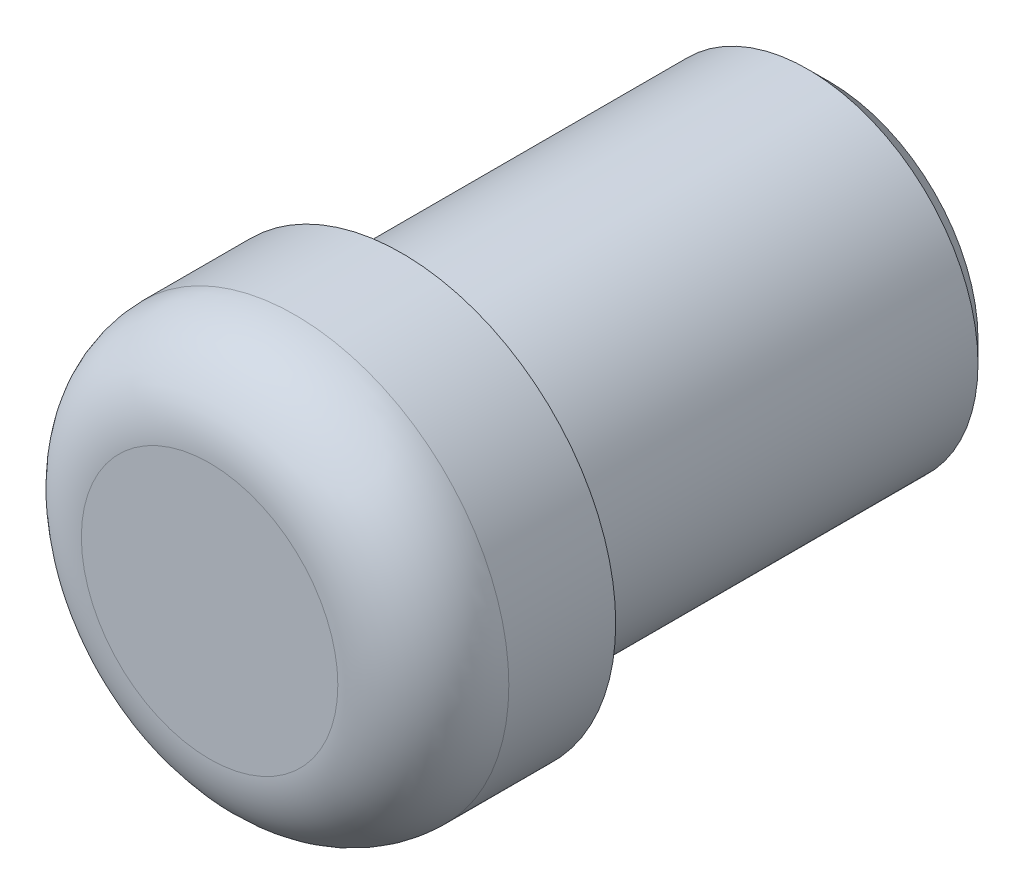
ISO-10303-21;
HEADER;
FILE_DESCRIPTION(('STEP AP214'),'2;1');
FILE_NAME('part.step','',(''),(''),'','','');
FILE_SCHEMA(('AUTOMOTIVE_DESIGN { 1 0 10303 214 1 1 1 1 }'));
ENDSEC;
DATA;
#1=APPLICATION_CONTEXT('core data for automotive mechanical design processes');
#2=APPLICATION_PROTOCOL_DEFINITION('international standard','automotive_design',2000,#1);
#3=PRODUCT_CONTEXT('',#1,'mechanical');
#4=PRODUCT('Part','Part','',(#3));
#5=PRODUCT_RELATED_PRODUCT_CATEGORY('part','',(#4));
#6=PRODUCT_DEFINITION_FORMATION('','',#4);
#7=PRODUCT_DEFINITION_CONTEXT('part definition',#1,'design');
#8=PRODUCT_DEFINITION('design','',#6,#7);
#9=PRODUCT_DEFINITION_SHAPE('','',#8);
#10=(LENGTH_UNIT() NAMED_UNIT(*) SI_UNIT(.MILLI.,.METRE.));
#11=(NAMED_UNIT(*) PLANE_ANGLE_UNIT() SI_UNIT($,.RADIAN.));
#12=(NAMED_UNIT(*) SI_UNIT($,.STERADIAN.) SOLID_ANGLE_UNIT());
#13=UNCERTAINTY_MEASURE_WITH_UNIT(LENGTH_MEASURE(1.E-05),#10,'distance_accuracy_value','');
#14=(GEOMETRIC_REPRESENTATION_CONTEXT(3) GLOBAL_UNCERTAINTY_ASSIGNED_CONTEXT((#13)) GLOBAL_UNIT_ASSIGNED_CONTEXT((#10,
#11,#12)) REPRESENTATION_CONTEXT('',''));
#15=CARTESIAN_POINT('',(0.,0.,0.));
#16=DIRECTION('',(0.,0.,1.));
#17=DIRECTION('',(1.,0.,0.));
#18=AXIS2_PLACEMENT_3D('',#15,#16,#17);
#19=CARTESIAN_POINT('',(0.,0.,10.));
#20=DIRECTION('',(0.,0.,-1.));
#21=DIRECTION('',(-1.,0.,0.));
#22=AXIS2_PLACEMENT_3D('',#19,#20,#21);
#23=CYLINDRICAL_SURFACE('',#22,3.975);
#24=CARTESIAN_POINT('',(0.,0.,0.500000000000002));
#25=DIRECTION('',(0.,0.,1.));
#26=DIRECTION('',(1.,0.,0.));
#27=AXIS2_PLACEMENT_3D('',#24,#25,#26);
#28=CIRCLE('',#27,3.975);
#29=CARTESIAN_POINT('',(3.975,0.,0.500000000000002));
#30=VERTEX_POINT('',#29);
#31=EDGE_CURVE('E52',#30,#30,#28,.T.);
#32=ORIENTED_EDGE('',*,*,#31,.T.);
#33=EDGE_LOOP('',(#32));
#34=FACE_BOUND('',#33,.T.);
#35=CARTESIAN_POINT('',(0.,0.,9.5));
#36=DIRECTION('',(0.,0.,1.));
#37=DIRECTION('',(1.,0.,0.));
#38=AXIS2_PLACEMENT_3D('',#35,#36,#37);
#39=CIRCLE('',#38,3.975);
#40=CARTESIAN_POINT('',(3.975,0.,9.5));
#41=VERTEX_POINT('',#40);
#42=EDGE_CURVE('E57',#41,#41,#39,.F.);
#43=ORIENTED_EDGE('',*,*,#42,.T.);
#44=EDGE_LOOP('',(#43));
#45=FACE_BOUND('',#44,.T.);
#46=ADVANCED_FACE('F43',(#34,#45),#23,.T.);
#47=CARTESIAN_POINT('',(0.,0.,0.));
#48=DIRECTION('',(0.,0.,1.));
#49=DIRECTION('',(1.,0.,0.));
#50=AXIS2_PLACEMENT_3D('',#47,#48,#49);
#51=PLANE('',#50);
#52=CARTESIAN_POINT('',(0.,0.,0.));
#53=DIRECTION('',(0.,0.,1.));
#54=DIRECTION('',(1.,0.,0.));
#55=AXIS2_PLACEMENT_3D('',#52,#53,#54);
#56=CIRCLE('',#55,3.475);
#57=CARTESIAN_POINT('',(3.475,0.,0.));
#58=VERTEX_POINT('',#57);
#59=EDGE_CURVE('E10',#58,#58,#56,.F.);
#60=ORIENTED_EDGE('',*,*,#59,.T.);
#61=EDGE_LOOP('',(#60));
#62=FACE_BOUND('',#61,.T.);
#63=ADVANCED_FACE('F100',(#62),#51,.F.);
#64=CARTESIAN_POINT('',(0.,0.,14.5));
#65=DIRECTION('',(0.,0.,-1.));
#66=DIRECTION('',(-1.,0.,0.));
#67=AXIS2_PLACEMENT_3D('',#64,#65,#66);
#68=CYLINDRICAL_SURFACE('',#67,5.);
#69=CARTESIAN_POINT('',(0.,0.,12.5));
#70=DIRECTION('',(0.,0.,1.));
#71=DIRECTION('',(1.,0.,0.));
#72=AXIS2_PLACEMENT_3D('',#69,#70,#71);
#73=CIRCLE('',#72,5.);
#74=CARTESIAN_POINT('',(5.,0.,12.5));
#75=VERTEX_POINT('',#74);
#76=EDGE_CURVE('E68',#75,#75,#73,.F.);
#77=ORIENTED_EDGE('',*,*,#76,.T.);
#78=EDGE_LOOP('',(#77));
#79=FACE_BOUND('',#78,.T.);
#80=CARTESIAN_POINT('',(0.,0.,10.));
#81=DIRECTION('',(0.,0.,1.));
#82=DIRECTION('',(1.,0.,0.));
#83=AXIS2_PLACEMENT_3D('',#80,#81,#82);
#84=CIRCLE('',#83,5.);
#85=CARTESIAN_POINT('',(5.,0.,10.));
#86=VERTEX_POINT('',#85);
#87=EDGE_CURVE('E76',#86,#86,#84,.T.);
#88=ORIENTED_EDGE('',*,*,#87,.T.);
#89=EDGE_LOOP('',(#88));
#90=FACE_BOUND('',#89,.T.);
#91=ADVANCED_FACE('F81',(#79,#90),#68,.T.);
#92=CARTESIAN_POINT('',(0.,0.,14.5));
#93=DIRECTION('',(0.,0.,1.));
#94=DIRECTION('',(1.,0.,0.));
#95=AXIS2_PLACEMENT_3D('',#92,#93,#94);
#96=PLANE('',#95);
#97=CARTESIAN_POINT('',(0.,0.,14.5));
#98=DIRECTION('',(0.,0.,1.));
#99=DIRECTION('',(1.,0.,0.));
#100=AXIS2_PLACEMENT_3D('',#97,#98,#99);
#101=CIRCLE('',#100,3.);
#102=CARTESIAN_POINT('',(3.,0.,14.5));
#103=VERTEX_POINT('',#102);
#104=EDGE_CURVE('E72',#103,#103,#101,.T.);
#105=ORIENTED_EDGE('',*,*,#104,.T.);
#106=EDGE_LOOP('',(#105));
#107=FACE_BOUND('',#106,.T.);
#108=ADVANCED_FACE('F86',(#107),#96,.T.);
#109=CARTESIAN_POINT('',(0.,0.,10.));
#110=DIRECTION('',(0.,0.,1.));
#111=DIRECTION('',(1.,0.,0.));
#112=AXIS2_PLACEMENT_3D('',#109,#110,#111);
#113=PLANE('',#112);
#114=CARTESIAN_POINT('',(0.,0.,10.));
#115=DIRECTION('',(0.,0.,1.));
#116=DIRECTION('',(1.,0.,0.));
#117=AXIS2_PLACEMENT_3D('',#114,#115,#116);
#118=CIRCLE('',#117,4.475);
#119=CARTESIAN_POINT('',(4.475,0.,10.));
#120=VERTEX_POINT('',#119);
#121=EDGE_CURVE('E62',#120,#120,#118,.T.);
#122=ORIENTED_EDGE('',*,*,#121,.T.);
#123=EDGE_LOOP('',(#122));
#124=FACE_BOUND('',#123,.T.);
#125=ORIENTED_EDGE('',*,*,#87,.F.);
#126=EDGE_LOOP('',(#125));
#127=FACE_BOUND('',#126,.T.);
#128=ADVANCED_FACE('F83',(#124,#127),#113,.F.);
#129=CARTESIAN_POINT('',(0.,0.,12.5));
#130=DIRECTION('',(0.,0.,1.));
#131=DIRECTION('',(1.,0.,0.));
#132=AXIS2_PLACEMENT_3D('',#129,#130,#131);
#133=TOROIDAL_SURFACE('',#132,3.,2.);
#134=ORIENTED_EDGE('',*,*,#76,.F.);
#135=EDGE_LOOP('',(#134));
#136=FACE_BOUND('',#135,.T.);
#137=ORIENTED_EDGE('',*,*,#104,.F.);
#138=EDGE_LOOP('',(#137));
#139=FACE_BOUND('',#138,.T.);
#140=ADVANCED_FACE('F85',(#136,#139),#133,.T.);
#141=CARTESIAN_POINT('',(0.,0.,9.5));
#142=DIRECTION('',(0.,0.,1.));
#143=DIRECTION('',(1.,0.,0.));
#144=AXIS2_PLACEMENT_3D('',#141,#142,#143);
#145=TOROIDAL_SURFACE('',#144,4.475,0.5);
#146=ORIENTED_EDGE('',*,*,#42,.F.);
#147=EDGE_LOOP('',(#146));
#148=FACE_BOUND('',#147,.T.);
#149=ORIENTED_EDGE('',*,*,#121,.F.);
#150=EDGE_LOOP('',(#149));
#151=FACE_BOUND('',#150,.T.);
#152=ADVANCED_FACE('F93',(#148,#151),#145,.F.);
#153=CARTESIAN_POINT('',(0.,0.,0.500000000000002));
#154=DIRECTION('',(0.,0.,1.));
#155=DIRECTION('',(1.,0.,0.));
#156=AXIS2_PLACEMENT_3D('',#153,#154,#155);
#157=CONICAL_SURFACE('',#156,3.975,0.785398163397451);
#158=ORIENTED_EDGE('',*,*,#59,.F.);
#159=EDGE_LOOP('',(#158));
#160=FACE_BOUND('',#159,.T.);
#161=ORIENTED_EDGE('',*,*,#31,.F.);
#162=EDGE_LOOP('',(#161));
#163=FACE_BOUND('',#162,.T.);
#164=ADVANCED_FACE('F46',(#160,#163),#157,.T.);
#165=CLOSED_SHELL('',(#46,#63,#91,#108,#128,#140,#152,#164));
#166=MANIFOLD_SOLID_BREP('B2',#165);
#167=ADVANCED_BREP_SHAPE_REPRESENTATION('',(#18,#166),#14);
#168=SHAPE_DEFINITION_REPRESENTATION(#9,#167);
ENDSEC;
END-ISO-10303-21;
